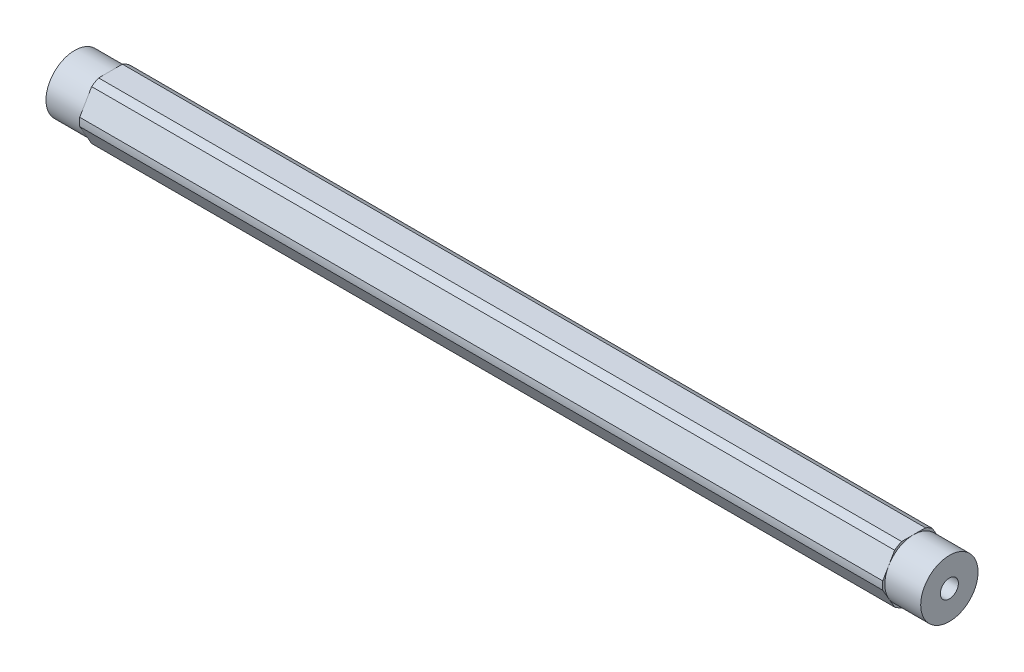
ISO-10303-21;
HEADER;
FILE_DESCRIPTION(('STEP AP214'),'2;1');
FILE_NAME('part.step','',(''),(''),'','','');
FILE_SCHEMA(('AUTOMOTIVE_DESIGN { 1 0 10303 214 1 1 1 1 }'));
ENDSEC;
DATA;
#1=APPLICATION_CONTEXT('core data for automotive mechanical design processes');
#2=APPLICATION_PROTOCOL_DEFINITION('international standard','automotive_design',2000,#1);
#3=PRODUCT_CONTEXT('',#1,'mechanical');
#4=PRODUCT('Part','Part','',(#3));
#5=PRODUCT_RELATED_PRODUCT_CATEGORY('part','',(#4));
#6=PRODUCT_DEFINITION_FORMATION('','',#4);
#7=PRODUCT_DEFINITION_CONTEXT('part definition',#1,'design');
#8=PRODUCT_DEFINITION('design','',#6,#7);
#9=PRODUCT_DEFINITION_SHAPE('','',#8);
#10=(LENGTH_UNIT() NAMED_UNIT(*) SI_UNIT(.MILLI.,.METRE.));
#11=(NAMED_UNIT(*) PLANE_ANGLE_UNIT() SI_UNIT($,.RADIAN.));
#12=(NAMED_UNIT(*) SI_UNIT($,.STERADIAN.) SOLID_ANGLE_UNIT());
#13=UNCERTAINTY_MEASURE_WITH_UNIT(LENGTH_MEASURE(1.E-05),#10,'distance_accuracy_value','');
#14=(GEOMETRIC_REPRESENTATION_CONTEXT(3) GLOBAL_UNCERTAINTY_ASSIGNED_CONTEXT((#13)) GLOBAL_UNIT_ASSIGNED_CONTEXT((#10,
#11,#12)) REPRESENTATION_CONTEXT('',''));
#15=CARTESIAN_POINT('',(0.,0.,0.));
#16=DIRECTION('',(0.,0.,1.));
#17=DIRECTION('',(1.,0.,0.));
#18=AXIS2_PLACEMENT_3D('',#15,#16,#17);
#19=CARTESIAN_POINT('',(96.8375,-977.584754964869,1111.82145070133));
#20=DIRECTION('',(1.,0.,0.));
#21=DIRECTION('',(0.,0.,-1.));
#22=AXIS2_PLACEMENT_3D('',#19,#20,#21);
#23=PLANE('',#22);
#24=CARTESIAN_POINT('',(96.8375,-977.584754964869,1111.82145070133));
#25=DIRECTION('',(1.,0.,0.));
#26=DIRECTION('',(0.,0.,-1.));
#27=AXIS2_PLACEMENT_3D('',#24,#25,#26);
#28=CIRCLE('',#27,2.);
#29=CARTESIAN_POINT('',(96.8375,-977.584754964869,1109.82145070133));
#30=VERTEX_POINT('',#29);
#31=EDGE_CURVE('E163',#30,#30,#28,.T.);
#32=ORIENTED_EDGE('',*,*,#31,.F.);
#33=EDGE_LOOP('',(#32));
#34=FACE_BOUND('',#33,.T.);
#35=CARTESIAN_POINT('',(96.8375,-977.584754964869,1111.82145070133));
#36=DIRECTION('',(-1.,0.,0.));
#37=DIRECTION('',(0.,0.,1.));
#38=AXIS2_PLACEMENT_3D('',#35,#36,#37);
#39=CIRCLE('',#38,6.35000000000015);
#40=CARTESIAN_POINT('',(96.8375,-977.584754964869,1118.17145070133));
#41=VERTEX_POINT('',#40);
#42=EDGE_CURVE('E437',#41,#41,#39,.T.);
#43=ORIENTED_EDGE('',*,*,#42,.F.);
#44=EDGE_LOOP('',(#43));
#45=FACE_BOUND('',#44,.T.);
#46=ADVANCED_FACE('F50',(#34,#45),#23,.T.);
#47=CARTESIAN_POINT('',(96.8375,-974.409481482148,1106.32171570133));
#48=DIRECTION('',(0.,-0.500000000000013,0.866025403784431));
#49=DIRECTION('',(0.,-0.866025403784431,-0.500000000000013));
#50=AXIS2_PLACEMENT_3D('',#47,#48,#49);
#51=PLANE('',#50);
#52=DIRECTION('',(-1.,0.,0.));
#53=VECTOR('',#52,1.);
#54=CARTESIAN_POINT('',(96.8375,-972.128662839692,1107.63854695852));
#55=LINE('',#54,#53);
#56=CARTESIAN_POINT('',(-88.9,-972.128662839692,1107.63854695852));
#57=VERTEX_POINT('',#56);
#58=CARTESIAN_POINT('',(88.9,-972.128662839692,1107.63854695852));
#59=VERTEX_POINT('',#58);
#60=EDGE_CURVE('E161',#57,#59,#55,.F.);
#61=ORIENTED_EDGE('',*,*,#60,.T.);
#62=DIRECTION('',(0.,-0.866025403784431,-0.500000000000013));
#63=VECTOR('',#62,1.);
#64=CARTESIAN_POINT('',(88.9,-974.409481482148,1106.32171570133));
#65=LINE('',#64,#63);
#66=CARTESIAN_POINT('',(88.9,-976.690300124604,1105.00488444414));
#67=VERTEX_POINT('',#66);
#68=EDGE_CURVE('E65',#59,#67,#65,.T.);
#69=ORIENTED_EDGE('',*,*,#68,.T.);
#70=DIRECTION('',(-1.,0.,0.));
#71=VECTOR('',#70,1.);
#72=CARTESIAN_POINT('',(96.8375,-976.690300124604,1105.00488444413));
#73=LINE('',#72,#71);
#74=CARTESIAN_POINT('',(-88.9,-976.690300124604,1105.00488444414));
#75=VERTEX_POINT('',#74);
#76=EDGE_CURVE('E153',#67,#75,#73,.T.);
#77=ORIENTED_EDGE('',*,*,#76,.T.);
#78=DIRECTION('',(0.,-0.866025403784431,-0.500000000000013));
#79=VECTOR('',#78,1.);
#80=CARTESIAN_POINT('',(-88.9,-974.409481482148,1106.32171570133));
#81=LINE('',#80,#79);
#82=EDGE_CURVE('E169',#57,#75,#81,.T.);
#83=ORIENTED_EDGE('',*,*,#82,.F.);
#84=EDGE_LOOP('',(#61,#69,#77,#83));
#85=FACE_BOUND('',#84,.T.);
#86=ADVANCED_FACE('F52',(#85),#51,.F.);
#87=CARTESIAN_POINT('',(96.8375,-971.234207999426,1111.82145070133));
#88=DIRECTION('',(0.,-1.,0.));
#89=DIRECTION('',(0.,0.,-1.));
#90=AXIS2_PLACEMENT_3D('',#87,#88,#89);
#91=PLANE('',#90);
#92=DIRECTION('',(-1.,0.,0.));
#93=VECTOR('',#92,1.);
#94=CARTESIAN_POINT('',(96.8375,-971.234207999426,1114.45511321572));
#95=LINE('',#94,#93);
#96=CARTESIAN_POINT('',(-88.9,-971.234207999426,1114.45511321572));
#97=VERTEX_POINT('',#96);
#98=CARTESIAN_POINT('',(88.9,-971.234207999426,1114.45511321572));
#99=VERTEX_POINT('',#98);
#100=EDGE_CURVE('E146',#97,#99,#95,.F.);
#101=ORIENTED_EDGE('',*,*,#100,.T.);
#102=DIRECTION('',(0.,0.,-1.));
#103=VECTOR('',#102,1.);
#104=CARTESIAN_POINT('',(88.9,-971.234207999426,1111.82145070133));
#105=LINE('',#104,#103);
#106=CARTESIAN_POINT('',(88.9,-971.234207999426,1109.18778818694));
#107=VERTEX_POINT('',#106);
#108=EDGE_CURVE('E138',#99,#107,#105,.T.);
#109=ORIENTED_EDGE('',*,*,#108,.T.);
#110=DIRECTION('',(-1.,0.,0.));
#111=VECTOR('',#110,1.);
#112=CARTESIAN_POINT('',(96.8375,-971.234207999426,1109.18778818694));
#113=LINE('',#112,#111);
#114=CARTESIAN_POINT('',(-88.9,-971.234207999426,1109.18778818694));
#115=VERTEX_POINT('',#114);
#116=EDGE_CURVE('E72',#107,#115,#113,.T.);
#117=ORIENTED_EDGE('',*,*,#116,.T.);
#118=DIRECTION('',(0.,0.,-1.));
#119=VECTOR('',#118,1.);
#120=CARTESIAN_POINT('',(-88.9,-971.234207999426,1111.82145070133));
#121=LINE('',#120,#119);
#122=EDGE_CURVE('E171',#97,#115,#121,.T.);
#123=ORIENTED_EDGE('',*,*,#122,.F.);
#124=EDGE_LOOP('',(#101,#109,#117,#123));
#125=FACE_BOUND('',#124,.T.);
#126=ADVANCED_FACE('F144',(#125),#91,.F.);
#127=CARTESIAN_POINT('',(96.8375,-974.409481482148,1117.32118570133));
#128=DIRECTION('',(0.,-0.500000000000013,-0.866025403784431));
#129=DIRECTION('',(0.,0.866025403784431,-0.500000000000013));
#130=AXIS2_PLACEMENT_3D('',#127,#128,#129);
#131=PLANE('',#130);
#132=DIRECTION('',(-1.,0.,0.));
#133=VECTOR('',#132,1.);
#134=CARTESIAN_POINT('',(96.8375,-976.690300124604,1118.63801695852));
#135=LINE('',#134,#133);
#136=CARTESIAN_POINT('',(-88.9,-976.690300124604,1118.63801695852));
#137=VERTEX_POINT('',#136);
#138=CARTESIAN_POINT('',(88.9,-976.690300124604,1118.63801695852));
#139=VERTEX_POINT('',#138);
#140=EDGE_CURVE('E151',#137,#139,#135,.F.);
#141=ORIENTED_EDGE('',*,*,#140,.T.);
#142=DIRECTION('',(0.,0.866025403784431,-0.500000000000013));
#143=VECTOR('',#142,1.);
#144=CARTESIAN_POINT('',(88.9,-974.409481482148,1117.32118570133));
#145=LINE('',#144,#143);
#146=CARTESIAN_POINT('',(88.9,-972.128662839691,1116.00435444413));
#147=VERTEX_POINT('',#146);
#148=EDGE_CURVE('E224',#139,#147,#145,.T.);
#149=ORIENTED_EDGE('',*,*,#148,.T.);
#150=DIRECTION('',(-1.,0.,0.));
#151=VECTOR('',#150,1.);
#152=CARTESIAN_POINT('',(96.8375,-972.128662839692,1116.00435444413));
#153=LINE('',#152,#151);
#154=CARTESIAN_POINT('',(-88.9,-972.12866283969,1116.00435444413));
#155=VERTEX_POINT('',#154);
#156=EDGE_CURVE('E156',#147,#155,#153,.T.);
#157=ORIENTED_EDGE('',*,*,#156,.T.);
#158=DIRECTION('',(0.,0.866025403784431,-0.500000000000013));
#159=VECTOR('',#158,1.);
#160=CARTESIAN_POINT('',(-88.9,-974.409481482148,1117.32118570133));
#161=LINE('',#160,#159);
#162=EDGE_CURVE('E186',#137,#155,#161,.T.);
#163=ORIENTED_EDGE('',*,*,#162,.F.);
#164=EDGE_LOOP('',(#141,#149,#157,#163));
#165=FACE_BOUND('',#164,.T.);
#166=ADVANCED_FACE('F222',(#165),#131,.F.);
#167=CARTESIAN_POINT('',(96.8375,-980.760028447591,1117.32118570133));
#168=DIRECTION('',(0.,0.500000000000013,-0.866025403784431));
#169=DIRECTION('',(0.,0.866025403784431,0.500000000000013));
#170=AXIS2_PLACEMENT_3D('',#167,#168,#169);
#171=PLANE('',#170);
#172=DIRECTION('',(-1.,0.,0.));
#173=VECTOR('',#172,1.);
#174=CARTESIAN_POINT('',(96.8375,-983.040847090047,1116.00435444413));
#175=LINE('',#174,#173);
#176=CARTESIAN_POINT('',(-88.9,-983.040847090047,1116.00435444414));
#177=VERTEX_POINT('',#176);
#178=CARTESIAN_POINT('',(88.9,-983.040847090047,1116.00435444414));
#179=VERTEX_POINT('',#178);
#180=EDGE_CURVE('E216',#177,#179,#175,.F.);
#181=ORIENTED_EDGE('',*,*,#180,.T.);
#182=DIRECTION('',(0.,0.866025403784431,0.500000000000013));
#183=VECTOR('',#182,1.);
#184=CARTESIAN_POINT('',(88.9,-980.760028447591,1117.32118570133));
#185=LINE('',#184,#183);
#186=CARTESIAN_POINT('',(88.9,-978.479209805135,1118.63801695852));
#187=VERTEX_POINT('',#186);
#188=EDGE_CURVE('E249',#179,#187,#185,.T.);
#189=ORIENTED_EDGE('',*,*,#188,.T.);
#190=DIRECTION('',(-1.,0.,0.));
#191=VECTOR('',#190,1.);
#192=CARTESIAN_POINT('',(96.8375,-978.479209805135,1118.63801695852));
#193=LINE('',#192,#191);
#194=CARTESIAN_POINT('',(-88.9,-978.479209805135,1118.63801695852));
#195=VERTEX_POINT('',#194);
#196=EDGE_CURVE('E214',#187,#195,#193,.T.);
#197=ORIENTED_EDGE('',*,*,#196,.T.);
#198=DIRECTION('',(0.,0.866025403784431,0.500000000000013));
#199=VECTOR('',#198,1.);
#200=CARTESIAN_POINT('',(-88.9,-980.760028447591,1117.32118570133));
#201=LINE('',#200,#199);
#202=EDGE_CURVE('E196',#177,#195,#201,.T.);
#203=ORIENTED_EDGE('',*,*,#202,.F.);
#204=EDGE_LOOP('',(#181,#189,#197,#203));
#205=FACE_BOUND('',#204,.T.);
#206=ADVANCED_FACE('F295',(#205),#171,.F.);
#207=CARTESIAN_POINT('',(96.8375,-983.935301930313,1111.82145070133));
#208=DIRECTION('',(0.,1.,0.));
#209=DIRECTION('',(0.,0.,1.));
#210=AXIS2_PLACEMENT_3D('',#207,#208,#209);
#211=PLANE('',#210);
#212=DIRECTION('',(-1.,0.,0.));
#213=VECTOR('',#212,1.);
#214=CARTESIAN_POINT('',(96.8375,-983.935301930313,1109.18778818694));
#215=LINE('',#214,#213);
#216=CARTESIAN_POINT('',(-88.9,-983.935301930312,1109.18778818694));
#217=VERTEX_POINT('',#216);
#218=CARTESIAN_POINT('',(88.9,-983.935301930312,1109.18778818694));
#219=VERTEX_POINT('',#218);
#220=EDGE_CURVE('E211',#217,#219,#215,.F.);
#221=ORIENTED_EDGE('',*,*,#220,.T.);
#222=DIRECTION('',(0.,0.,1.));
#223=VECTOR('',#222,1.);
#224=CARTESIAN_POINT('',(88.9,-983.935301930313,1111.82145070133));
#225=LINE('',#224,#223);
#226=CARTESIAN_POINT('',(88.9,-983.935301930313,1114.45511321572));
#227=VERTEX_POINT('',#226);
#228=EDGE_CURVE('E246',#219,#227,#225,.T.);
#229=ORIENTED_EDGE('',*,*,#228,.T.);
#230=DIRECTION('',(-1.,0.,0.));
#231=VECTOR('',#230,1.);
#232=CARTESIAN_POINT('',(96.8375,-983.935301930313,1114.45511321572));
#233=LINE('',#232,#231);
#234=CARTESIAN_POINT('',(-88.9,-983.935301930313,1114.45511321572));
#235=VERTEX_POINT('',#234);
#236=EDGE_CURVE('E209',#227,#235,#233,.T.);
#237=ORIENTED_EDGE('',*,*,#236,.T.);
#238=DIRECTION('',(0.,0.,1.));
#239=VECTOR('',#238,1.);
#240=CARTESIAN_POINT('',(-88.9,-983.935301930313,1111.82145070133));
#241=LINE('',#240,#239);
#242=EDGE_CURVE('E193',#217,#235,#241,.T.);
#243=ORIENTED_EDGE('',*,*,#242,.F.);
#244=EDGE_LOOP('',(#221,#229,#237,#243));
#245=FACE_BOUND('',#244,.T.);
#246=ADVANCED_FACE('F291',(#245),#211,.F.);
#247=CARTESIAN_POINT('',(96.8375,-980.760028447591,1106.32171570133));
#248=DIRECTION('',(0.,0.500000000000013,0.866025403784431));
#249=DIRECTION('',(0.,-0.866025403784431,0.500000000000013));
#250=AXIS2_PLACEMENT_3D('',#247,#248,#249);
#251=PLANE('',#250);
#252=DIRECTION('',(-1.,0.,0.));
#253=VECTOR('',#252,1.);
#254=CARTESIAN_POINT('',(96.8375,-978.479209805135,1105.00488444413));
#255=LINE('',#254,#253);
#256=CARTESIAN_POINT('',(-88.9,-978.479209805135,1105.00488444414));
#257=VERTEX_POINT('',#256);
#258=CARTESIAN_POINT('',(88.9,-978.479209805135,1105.00488444414));
#259=VERTEX_POINT('',#258);
#260=EDGE_CURVE('E206',#257,#259,#255,.F.);
#261=ORIENTED_EDGE('',*,*,#260,.T.);
#262=DIRECTION('',(0.,-0.866025403784431,0.500000000000013));
#263=VECTOR('',#262,1.);
#264=CARTESIAN_POINT('',(88.9,-980.760028447591,1106.32171570133));
#265=LINE('',#264,#263);
#266=CARTESIAN_POINT('',(88.9,-983.040847090047,1107.63854695852));
#267=VERTEX_POINT('',#266);
#268=EDGE_CURVE('E233',#259,#267,#265,.T.);
#269=ORIENTED_EDGE('',*,*,#268,.T.);
#270=DIRECTION('',(-1.,0.,0.));
#271=VECTOR('',#270,1.);
#272=CARTESIAN_POINT('',(96.8375,-983.040847090047,1107.63854695852));
#273=LINE('',#272,#271);
#274=CARTESIAN_POINT('',(-88.9,-983.040847090047,1107.63854695852));
#275=VERTEX_POINT('',#274);
#276=EDGE_CURVE('E204',#267,#275,#273,.T.);
#277=ORIENTED_EDGE('',*,*,#276,.T.);
#278=DIRECTION('',(0.,-0.866025403784431,0.500000000000013));
#279=VECTOR('',#278,1.);
#280=CARTESIAN_POINT('',(-88.9,-980.760028447591,1106.32171570133));
#281=LINE('',#280,#279);
#282=EDGE_CURVE('E183',#257,#275,#281,.T.);
#283=ORIENTED_EDGE('',*,*,#282,.F.);
#284=EDGE_LOOP('',(#261,#269,#277,#283));
#285=FACE_BOUND('',#284,.T.);
#286=ADVANCED_FACE('F287',(#285),#251,.F.);
#287=CARTESIAN_POINT('',(96.8375,-977.584754964869,1111.82145070133));
#288=DIRECTION('',(-1.,0.,0.));
#289=DIRECTION('',(0.,0.,1.));
#290=AXIS2_PLACEMENT_3D('',#287,#288,#289);
#291=CYLINDRICAL_SURFACE('',#290,6.875);
#292=ORIENTED_EDGE('',*,*,#276,.F.);
#293=CARTESIAN_POINT('',(88.9,-977.584754964869,1111.82145070133));
#294=DIRECTION('',(-1.,0.,0.));
#295=DIRECTION('',(0.,0.,1.));
#296=AXIS2_PLACEMENT_3D('',#293,#294,#295);
#297=CIRCLE('',#296,6.875);
#298=EDGE_CURVE('E243',#267,#219,#297,.T.);
#299=ORIENTED_EDGE('',*,*,#298,.T.);
#300=ORIENTED_EDGE('',*,*,#220,.F.);
#301=CARTESIAN_POINT('',(-88.9,-977.584754964869,1111.82145070133));
#302=DIRECTION('',(-1.,0.,0.));
#303=DIRECTION('',(0.,0.,1.));
#304=AXIS2_PLACEMENT_3D('',#301,#302,#303);
#305=CIRCLE('',#304,6.875);
#306=EDGE_CURVE('E191',#275,#217,#305,.T.);
#307=ORIENTED_EDGE('',*,*,#306,.F.);
#308=EDGE_LOOP('',(#292,#299,#300,#307));
#309=FACE_BOUND('',#308,.T.);
#310=ADVANCED_FACE('F290',(#309),#291,.T.);
#311=ORIENTED_EDGE('',*,*,#76,.F.);
#312=CARTESIAN_POINT('',(88.9,-977.584754964869,1111.82145070133));
#313=DIRECTION('',(-1.,0.,0.));
#314=DIRECTION('',(0.,0.,1.));
#315=AXIS2_PLACEMENT_3D('',#312,#313,#314);
#316=CIRCLE('',#315,6.875);
#317=EDGE_CURVE('E230',#67,#259,#316,.T.);
#318=ORIENTED_EDGE('',*,*,#317,.T.);
#319=ORIENTED_EDGE('',*,*,#260,.F.);
#320=CARTESIAN_POINT('',(-88.9,-977.584754964869,1111.82145070133));
#321=DIRECTION('',(-1.,0.,0.));
#322=DIRECTION('',(0.,0.,1.));
#323=AXIS2_PLACEMENT_3D('',#320,#321,#322);
#324=CIRCLE('',#323,6.875);
#325=EDGE_CURVE('E176',#75,#257,#324,.T.);
#326=ORIENTED_EDGE('',*,*,#325,.F.);
#327=EDGE_LOOP('',(#311,#318,#319,#326));
#328=FACE_BOUND('',#327,.T.);
#329=ADVANCED_FACE('F328',(#328),#291,.T.);
#330=ORIENTED_EDGE('',*,*,#236,.F.);
#331=CARTESIAN_POINT('',(88.9,-977.584754964869,1111.82145070133));
#332=DIRECTION('',(-1.,0.,0.));
#333=DIRECTION('',(0.,0.,1.));
#334=AXIS2_PLACEMENT_3D('',#331,#332,#333);
#335=CIRCLE('',#334,6.875);
#336=EDGE_CURVE('E252',#227,#179,#335,.T.);
#337=ORIENTED_EDGE('',*,*,#336,.T.);
#338=ORIENTED_EDGE('',*,*,#180,.F.);
#339=CARTESIAN_POINT('',(-88.9,-977.584754964869,1111.82145070133));
#340=DIRECTION('',(-1.,0.,0.));
#341=DIRECTION('',(0.,0.,1.));
#342=AXIS2_PLACEMENT_3D('',#339,#340,#341);
#343=CIRCLE('',#342,6.875);
#344=EDGE_CURVE('E199',#235,#177,#343,.T.);
#345=ORIENTED_EDGE('',*,*,#344,.F.);
#346=EDGE_LOOP('',(#330,#337,#338,#345));
#347=FACE_BOUND('',#346,.T.);
#348=ADVANCED_FACE('F335',(#347),#291,.T.);
#349=ORIENTED_EDGE('',*,*,#196,.F.);
#350=CARTESIAN_POINT('',(88.9,-977.584754964869,1111.82145070133));
#351=DIRECTION('',(-1.,0.,0.));
#352=DIRECTION('',(0.,0.,1.));
#353=AXIS2_PLACEMENT_3D('',#350,#351,#352);
#354=CIRCLE('',#353,6.875);
#355=EDGE_CURVE('E240',#187,#139,#354,.T.);
#356=ORIENTED_EDGE('',*,*,#355,.T.);
#357=ORIENTED_EDGE('',*,*,#140,.F.);
#358=CARTESIAN_POINT('',(-88.9,-977.584754964869,1111.82145070133));
#359=DIRECTION('',(-1.,0.,0.));
#360=DIRECTION('',(0.,0.,1.));
#361=AXIS2_PLACEMENT_3D('',#358,#359,#360);
#362=CIRCLE('',#361,6.875);
#363=EDGE_CURVE('E189',#195,#137,#362,.T.);
#364=ORIENTED_EDGE('',*,*,#363,.F.);
#365=EDGE_LOOP('',(#349,#356,#357,#364));
#366=FACE_BOUND('',#365,.T.);
#367=ADVANCED_FACE('F342',(#366),#291,.T.);
#368=ORIENTED_EDGE('',*,*,#156,.F.);
#369=CARTESIAN_POINT('',(88.9,-977.584754964869,1111.82145070133));
#370=DIRECTION('',(-1.,0.,0.));
#371=DIRECTION('',(0.,0.,1.));
#372=AXIS2_PLACEMENT_3D('',#369,#370,#371);
#373=CIRCLE('',#372,6.875);
#374=EDGE_CURVE('E229',#147,#99,#373,.T.);
#375=ORIENTED_EDGE('',*,*,#374,.T.);
#376=ORIENTED_EDGE('',*,*,#100,.F.);
#377=CARTESIAN_POINT('',(-88.9,-977.584754964869,1111.82145070133));
#378=DIRECTION('',(-1.,0.,0.));
#379=DIRECTION('',(0.,0.,1.));
#380=AXIS2_PLACEMENT_3D('',#377,#378,#379);
#381=CIRCLE('',#380,6.875);
#382=EDGE_CURVE('E174',#155,#97,#381,.T.);
#383=ORIENTED_EDGE('',*,*,#382,.F.);
#384=EDGE_LOOP('',(#368,#375,#376,#383));
#385=FACE_BOUND('',#384,.T.);
#386=ADVANCED_FACE('F228',(#385),#291,.T.);
#387=ORIENTED_EDGE('',*,*,#116,.F.);
#388=CARTESIAN_POINT('',(88.9,-977.584754964869,1111.82145070133));
#389=DIRECTION('',(-1.,0.,0.));
#390=DIRECTION('',(0.,0.,1.));
#391=AXIS2_PLACEMENT_3D('',#388,#389,#390);
#392=CIRCLE('',#391,6.875);
#393=EDGE_CURVE('E12',#107,#59,#392,.T.);
#394=ORIENTED_EDGE('',*,*,#393,.T.);
#395=ORIENTED_EDGE('',*,*,#60,.F.);
#396=CARTESIAN_POINT('',(-88.9,-977.584754964869,1111.82145070133));
#397=DIRECTION('',(-1.,0.,0.));
#398=DIRECTION('',(0.,0.,1.));
#399=AXIS2_PLACEMENT_3D('',#396,#397,#398);
#400=CIRCLE('',#399,6.875);
#401=EDGE_CURVE('E58',#115,#57,#400,.T.);
#402=ORIENTED_EDGE('',*,*,#401,.F.);
#403=EDGE_LOOP('',(#387,#394,#395,#402));
#404=FACE_BOUND('',#403,.T.);
#405=ADVANCED_FACE('F150',(#404),#291,.T.);
#406=CARTESIAN_POINT('',(-96.8375,-977.584754964869,1111.82145070133));
#407=DIRECTION('',(-1.,0.,0.));
#408=DIRECTION('',(0.,0.,-1.));
#409=AXIS2_PLACEMENT_3D('',#406,#407,#408);
#410=PLANE('',#409);
#411=CARTESIAN_POINT('',(-96.8375,-977.584754964869,1111.82145070133));
#412=DIRECTION('',(-1.,0.,0.));
#413=DIRECTION('',(0.,0.,1.));
#414=AXIS2_PLACEMENT_3D('',#411,#412,#413);
#415=CIRCLE('',#414,2.);
#416=CARTESIAN_POINT('',(-96.8375,-977.584754964869,1113.82145070133));
#417=VERTEX_POINT('',#416);
#418=EDGE_CURVE('E201',#417,#417,#415,.T.);
#419=ORIENTED_EDGE('',*,*,#418,.F.);
#420=EDGE_LOOP('',(#419));
#421=FACE_BOUND('',#420,.T.);
#422=CARTESIAN_POINT('',(-96.8375,-977.584754964869,1111.82145070133));
#423=DIRECTION('',(-1.,0.,0.));
#424=DIRECTION('',(0.,0.,1.));
#425=AXIS2_PLACEMENT_3D('',#422,#423,#424);
#426=CIRCLE('',#425,6.35000000000015);
#427=CARTESIAN_POINT('',(-96.8375,-977.584754964869,1118.17145070133));
#428=VERTEX_POINT('',#427);
#429=EDGE_CURVE('E255',#428,#428,#426,.T.);
#430=ORIENTED_EDGE('',*,*,#429,.T.);
#431=EDGE_LOOP('',(#430));
#432=FACE_BOUND('',#431,.T.);
#433=ADVANCED_FACE('F260',(#421,#432),#410,.T.);
#434=CARTESIAN_POINT('',(96.8375,-977.584754964869,1111.82145070133));
#435=DIRECTION('',(-1.,0.,0.));
#436=DIRECTION('',(0.,0.,1.));
#437=AXIS2_PLACEMENT_3D('',#434,#435,#436);
#438=CYLINDRICAL_SURFACE('',#437,2.);
#439=ORIENTED_EDGE('',*,*,#31,.T.);
#440=EDGE_LOOP('',(#439));
#441=FACE_BOUND('',#440,.T.);
#442=ORIENTED_EDGE('',*,*,#418,.T.);
#443=EDGE_LOOP('',(#442));
#444=FACE_BOUND('',#443,.T.);
#445=ADVANCED_FACE('F273',(#441,#444),#438,.F.);
#446=CARTESIAN_POINT('',(-88.9,-977.584754964869,1111.82145070133));
#447=DIRECTION('',(-1.,0.,0.));
#448=DIRECTION('',(0.,0.,1.));
#449=AXIS2_PLACEMENT_3D('',#446,#447,#448);
#450=PLANE('',#449);
#451=CARTESIAN_POINT('',(-88.9,-977.584754964869,1111.82145070133));
#452=DIRECTION('',(-1.,0.,0.));
#453=DIRECTION('',(0.,0.,1.));
#454=AXIS2_PLACEMENT_3D('',#451,#452,#453);
#455=CIRCLE('',#454,6.35000000000015);
#456=CARTESIAN_POINT('',(-88.9,-977.584754964869,1118.17145070133));
#457=VERTEX_POINT('',#456);
#458=EDGE_CURVE('E178',#457,#457,#455,.T.);
#459=ORIENTED_EDGE('',*,*,#458,.F.);
#460=EDGE_LOOP('',(#459));
#461=FACE_BOUND('',#460,.T.);
#462=ORIENTED_EDGE('',*,*,#344,.T.);
#463=ORIENTED_EDGE('',*,*,#202,.T.);
#464=ORIENTED_EDGE('',*,*,#363,.T.);
#465=ORIENTED_EDGE('',*,*,#162,.T.);
#466=ORIENTED_EDGE('',*,*,#382,.T.);
#467=ORIENTED_EDGE('',*,*,#122,.T.);
#468=ORIENTED_EDGE('',*,*,#401,.T.);
#469=ORIENTED_EDGE('',*,*,#82,.T.);
#470=ORIENTED_EDGE('',*,*,#325,.T.);
#471=ORIENTED_EDGE('',*,*,#282,.T.);
#472=ORIENTED_EDGE('',*,*,#306,.T.);
#473=ORIENTED_EDGE('',*,*,#242,.T.);
#474=EDGE_LOOP('',(#462,#463,#464,#465,#466,#467,#468,#469,#470,#471,#472,#473));
#475=FACE_BOUND('',#474,.T.);
#476=ADVANCED_FACE('F168',(#461,#475),#450,.T.);
#477=CARTESIAN_POINT('',(-88.9,-977.584754964869,1111.82145070133));
#478=DIRECTION('',(-1.,0.,0.));
#479=DIRECTION('',(0.,0.,1.));
#480=AXIS2_PLACEMENT_3D('',#477,#478,#479);
#481=CYLINDRICAL_SURFACE('',#480,6.35000000000015);
#482=ORIENTED_EDGE('',*,*,#458,.T.);
#483=EDGE_LOOP('',(#482));
#484=FACE_BOUND('',#483,.T.);
#485=ORIENTED_EDGE('',*,*,#429,.F.);
#486=EDGE_LOOP('',(#485));
#487=FACE_BOUND('',#486,.T.);
#488=ADVANCED_FACE('F262',(#484,#487),#481,.T.);
#489=CARTESIAN_POINT('',(88.9,-977.584754964869,1111.82145070133));
#490=DIRECTION('',(-1.,0.,0.));
#491=DIRECTION('',(0.,0.,1.));
#492=AXIS2_PLACEMENT_3D('',#489,#490,#491);
#493=PLANE('',#492);
#494=CARTESIAN_POINT('',(88.9,-977.584754964869,1111.82145070133));
#495=DIRECTION('',(-1.,0.,0.));
#496=DIRECTION('',(0.,0.,1.));
#497=AXIS2_PLACEMENT_3D('',#494,#495,#496);
#498=CIRCLE('',#497,6.35000000000015);
#499=CARTESIAN_POINT('',(88.9,-977.584754964869,1118.17145070133));
#500=VERTEX_POINT('',#499);
#501=EDGE_CURVE('E147',#500,#500,#498,.T.);
#502=ORIENTED_EDGE('',*,*,#501,.T.);
#503=EDGE_LOOP('',(#502));
#504=FACE_BOUND('',#503,.T.);
#505=ORIENTED_EDGE('',*,*,#228,.F.);
#506=ORIENTED_EDGE('',*,*,#298,.F.);
#507=ORIENTED_EDGE('',*,*,#268,.F.);
#508=ORIENTED_EDGE('',*,*,#317,.F.);
#509=ORIENTED_EDGE('',*,*,#68,.F.);
#510=ORIENTED_EDGE('',*,*,#393,.F.);
#511=ORIENTED_EDGE('',*,*,#108,.F.);
#512=ORIENTED_EDGE('',*,*,#374,.F.);
#513=ORIENTED_EDGE('',*,*,#148,.F.);
#514=ORIENTED_EDGE('',*,*,#355,.F.);
#515=ORIENTED_EDGE('',*,*,#188,.F.);
#516=ORIENTED_EDGE('',*,*,#336,.F.);
#517=EDGE_LOOP('',(#505,#506,#507,#508,#509,#510,#511,#512,#513,#514,#515,#516));
#518=FACE_BOUND('',#517,.T.);
#519=ADVANCED_FACE('F137',(#504,#518),#493,.F.);
#520=CARTESIAN_POINT('',(88.9,-977.584754964869,1111.82145070133));
#521=DIRECTION('',(1.,0.,0.));
#522=DIRECTION('',(0.,0.,-1.));
#523=AXIS2_PLACEMENT_3D('',#520,#521,#522);
#524=CYLINDRICAL_SURFACE('',#523,6.35000000000015);
#525=ORIENTED_EDGE('',*,*,#501,.F.);
#526=EDGE_LOOP('',(#525));
#527=FACE_BOUND('',#526,.T.);
#528=ORIENTED_EDGE('',*,*,#42,.T.);
#529=EDGE_LOOP('',(#528));
#530=FACE_BOUND('',#529,.T.);
#531=ADVANCED_FACE('F270',(#527,#530),#524,.T.);
#532=CLOSED_SHELL('',(#46,#86,#126,#166,#206,#246,#286,#310,#329,#348,#367,#386,#405,#433,#445,
#476,#488,#519,#531));
#533=MANIFOLD_SOLID_BREP('B2',#532);
#534=ADVANCED_BREP_SHAPE_REPRESENTATION('',(#18,#533),#14);
#535=SHAPE_DEFINITION_REPRESENTATION(#9,#534);
ENDSEC;
END-ISO-10303-21;
